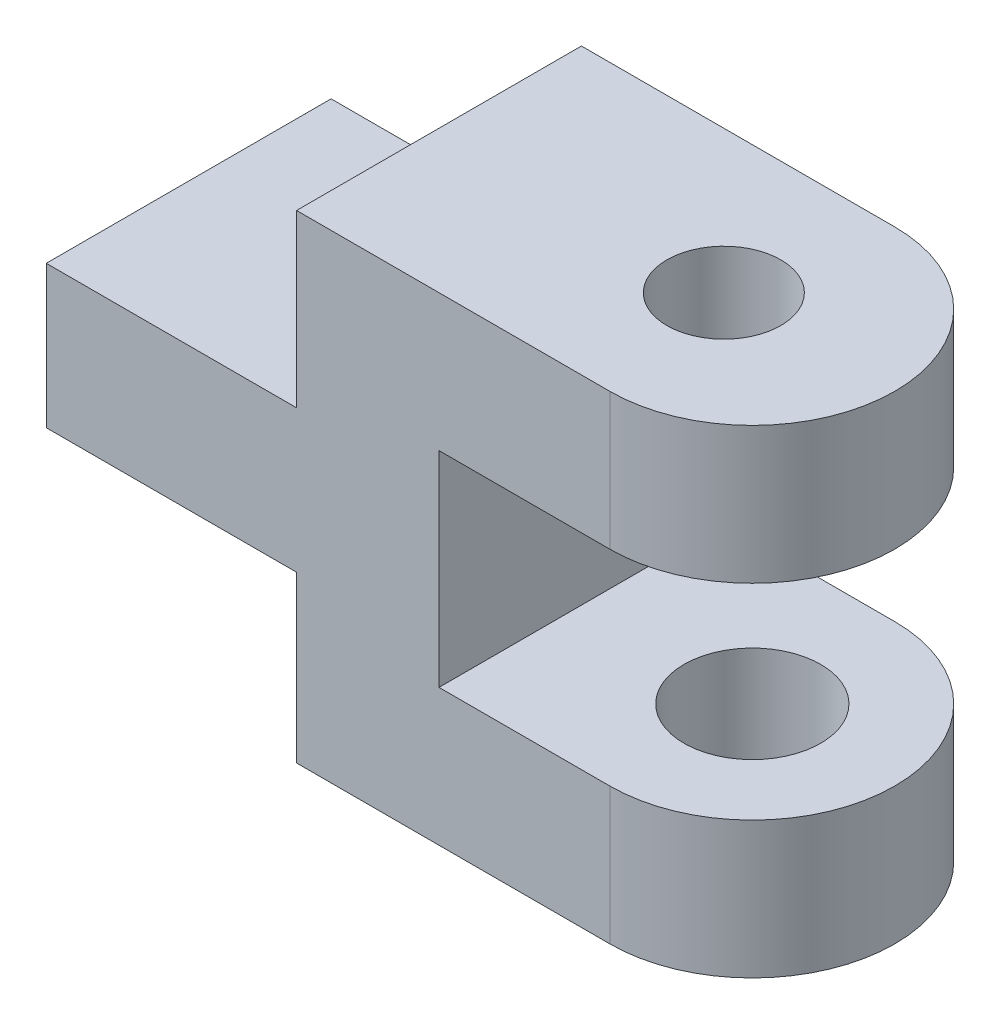
ISO-10303-21;
HEADER;
FILE_DESCRIPTION(('STEP AP214'),'2;1');
FILE_NAME('part.step','',(''),(''),'','','');
FILE_SCHEMA(('AUTOMOTIVE_DESIGN { 1 0 10303 214 1 1 1 1 }'));
ENDSEC;
DATA;
#1=APPLICATION_CONTEXT('core data for automotive mechanical design processes');
#2=APPLICATION_PROTOCOL_DEFINITION('international standard','automotive_design',2000,#1);
#3=PRODUCT_CONTEXT('',#1,'mechanical');
#4=PRODUCT('Part','Part','',(#3));
#5=PRODUCT_RELATED_PRODUCT_CATEGORY('part','',(#4));
#6=PRODUCT_DEFINITION_FORMATION('','',#4);
#7=PRODUCT_DEFINITION_CONTEXT('part definition',#1,'design');
#8=PRODUCT_DEFINITION('design','',#6,#7);
#9=PRODUCT_DEFINITION_SHAPE('','',#8);
#10=(LENGTH_UNIT() NAMED_UNIT(*) SI_UNIT(.MILLI.,.METRE.));
#11=(NAMED_UNIT(*) PLANE_ANGLE_UNIT() SI_UNIT($,.RADIAN.));
#12=(NAMED_UNIT(*) SI_UNIT($,.STERADIAN.) SOLID_ANGLE_UNIT());
#13=UNCERTAINTY_MEASURE_WITH_UNIT(LENGTH_MEASURE(1.E-05),#10,'distance_accuracy_value','');
#14=(GEOMETRIC_REPRESENTATION_CONTEXT(3) GLOBAL_UNCERTAINTY_ASSIGNED_CONTEXT((#13)) GLOBAL_UNIT_ASSIGNED_CONTEXT((#10,
#11,#12)) REPRESENTATION_CONTEXT('',''));
#15=CARTESIAN_POINT('',(0.,0.,0.));
#16=DIRECTION('',(0.,0.,1.));
#17=DIRECTION('',(1.,0.,0.));
#18=AXIS2_PLACEMENT_3D('',#15,#16,#17);
#19=CARTESIAN_POINT('',(0.,12.5,25.));
#20=DIRECTION('',(1.,0.,0.));
#21=DIRECTION('',(0.,0.,-1.));
#22=AXIS2_PLACEMENT_3D('',#19,#20,#21);
#23=PLANE('',#22);
#24=DIRECTION('',(0.,-1.,0.));
#25=VECTOR('',#24,1.);
#26=CARTESIAN_POINT('',(0.,12.5,0.));
#27=LINE('',#26,#25);
#28=CARTESIAN_POINT('',(0.,12.5,0.));
#29=VERTEX_POINT('',#28);
#30=CARTESIAN_POINT('',(0.,0.,0.));
#31=VERTEX_POINT('',#30);
#32=EDGE_CURVE('E161',#29,#31,#27,.T.);
#33=ORIENTED_EDGE('',*,*,#32,.T.);
#34=DIRECTION('',(0.,0.,-1.));
#35=VECTOR('',#34,1.);
#36=CARTESIAN_POINT('',(0.,0.,25.));
#37=LINE('',#36,#35);
#38=CARTESIAN_POINT('',(0.,0.,25.));
#39=VERTEX_POINT('',#38);
#40=EDGE_CURVE('E11',#39,#31,#37,.T.);
#41=ORIENTED_EDGE('',*,*,#40,.F.);
#42=DIRECTION('',(0.,-1.,0.));
#43=VECTOR('',#42,1.);
#44=CARTESIAN_POINT('',(0.,12.5,25.));
#45=LINE('',#44,#43);
#46=CARTESIAN_POINT('',(0.,12.5,25.));
#47=VERTEX_POINT('',#46);
#48=EDGE_CURVE('E198',#47,#39,#45,.T.);
#49=ORIENTED_EDGE('',*,*,#48,.F.);
#50=DIRECTION('',(0.,0.,-1.));
#51=VECTOR('',#50,1.);
#52=CARTESIAN_POINT('',(0.,12.5,25.));
#53=LINE('',#52,#51);
#54=EDGE_CURVE('E157',#47,#29,#53,.T.);
#55=ORIENTED_EDGE('',*,*,#54,.T.);
#56=EDGE_LOOP('',(#33,#41,#49,#55));
#57=FACE_BOUND('',#56,.T.);
#58=ADVANCED_FACE('F39',(#57),#23,.F.);
#59=CARTESIAN_POINT('',(0.,0.,25.));
#60=DIRECTION('',(0.,1.,0.));
#61=DIRECTION('',(0.,0.,1.));
#62=AXIS2_PLACEMENT_3D('',#59,#60,#61);
#63=PLANE('',#62);
#64=DIRECTION('',(1.,0.,0.));
#65=VECTOR('',#64,1.);
#66=CARTESIAN_POINT('',(0.,0.,0.));
#67=LINE('',#66,#65);
#68=CARTESIAN_POINT('',(21.969696969697,0.,0.));
#69=VERTEX_POINT('',#68);
#70=EDGE_CURVE('E165',#31,#69,#67,.T.);
#71=ORIENTED_EDGE('',*,*,#70,.T.);
#72=DIRECTION('',(0.,0.,-1.));
#73=VECTOR('',#72,1.);
#74=CARTESIAN_POINT('',(21.969696969697,0.,25.));
#75=LINE('',#74,#73);
#76=CARTESIAN_POINT('',(21.969696969697,0.,25.));
#77=VERTEX_POINT('',#76);
#78=EDGE_CURVE('E48',#77,#69,#75,.T.);
#79=ORIENTED_EDGE('',*,*,#78,.F.);
#80=DIRECTION('',(1.,0.,0.));
#81=VECTOR('',#80,1.);
#82=CARTESIAN_POINT('',(0.,0.,25.));
#83=LINE('',#82,#81);
#84=EDGE_CURVE('E106',#39,#77,#83,.T.);
#85=ORIENTED_EDGE('',*,*,#84,.F.);
#86=ORIENTED_EDGE('',*,*,#40,.T.);
#87=EDGE_LOOP('',(#71,#79,#85,#86));
#88=FACE_BOUND('',#87,.T.);
#89=ADVANCED_FACE('F278',(#88),#63,.F.);
#90=CARTESIAN_POINT('',(21.969696969697,0.,25.));
#91=DIRECTION('',(1.,0.,0.));
#92=DIRECTION('',(0.,1.,0.));
#93=AXIS2_PLACEMENT_3D('',#90,#91,#92);
#94=PLANE('',#93);
#95=DIRECTION('',(0.,-1.,0.));
#96=VECTOR('',#95,1.);
#97=CARTESIAN_POINT('',(21.969696969697,0.,0.));
#98=LINE('',#97,#96);
#99=CARTESIAN_POINT('',(21.969696969697,-14.5,0.));
#100=VERTEX_POINT('',#99);
#101=EDGE_CURVE('E169',#69,#100,#98,.T.);
#102=ORIENTED_EDGE('',*,*,#101,.T.);
#103=DIRECTION('',(0.,0.,-1.));
#104=VECTOR('',#103,1.);
#105=CARTESIAN_POINT('',(21.969696969697,-14.5,25.));
#106=LINE('',#105,#104);
#107=CARTESIAN_POINT('',(21.969696969697,-14.5,25.));
#108=VERTEX_POINT('',#107);
#109=EDGE_CURVE('E210',#108,#100,#106,.T.);
#110=ORIENTED_EDGE('',*,*,#109,.F.);
#111=DIRECTION('',(0.,-1.,0.));
#112=VECTOR('',#111,1.);
#113=CARTESIAN_POINT('',(21.969696969697,0.,25.));
#114=LINE('',#113,#112);
#115=EDGE_CURVE('E220',#77,#108,#114,.T.);
#116=ORIENTED_EDGE('',*,*,#115,.F.);
#117=ORIENTED_EDGE('',*,*,#78,.T.);
#118=EDGE_LOOP('',(#102,#110,#116,#117));
#119=FACE_BOUND('',#118,.T.);
#120=ADVANCED_FACE('F218',(#119),#94,.F.);
#121=CARTESIAN_POINT('',(21.969696969697,-14.5,25.));
#122=DIRECTION('',(0.,1.,0.));
#123=DIRECTION('',(-1.,0.,0.));
#124=AXIS2_PLACEMENT_3D('',#121,#122,#123);
#125=PLANE('',#124);
#126=CARTESIAN_POINT('',(49.469696969697,-14.5,12.5));
#127=DIRECTION('',(0.,1.,0.));
#128=DIRECTION('',(-1.,0.,0.));
#129=AXIS2_PLACEMENT_3D('',#126,#127,#128);
#130=CIRCLE('',#129,6.);
#131=CARTESIAN_POINT('',(43.469696969697,-14.5,12.5));
#132=VERTEX_POINT('',#131);
#133=EDGE_CURVE('E330',#132,#132,#130,.T.);
#134=ORIENTED_EDGE('',*,*,#133,.T.);
#135=EDGE_LOOP('',(#134));
#136=FACE_BOUND('',#135,.T.);
#137=DIRECTION('',(1.,0.,0.));
#138=VECTOR('',#137,1.);
#139=CARTESIAN_POINT('',(21.969696969697,-14.5,0.));
#140=LINE('',#139,#138);
#141=CARTESIAN_POINT('',(49.469696969697,-14.5,0.));
#142=VERTEX_POINT('',#141);
#143=EDGE_CURVE('E172',#100,#142,#140,.T.);
#144=ORIENTED_EDGE('',*,*,#143,.T.);
#145=CARTESIAN_POINT('',(49.469696969697,-14.5,12.5));
#146=DIRECTION('',(0.,1.,0.));
#147=DIRECTION('',(-1.,0.,0.));
#148=AXIS2_PLACEMENT_3D('',#145,#146,#147);
#149=CIRCLE('',#148,12.5);
#150=CARTESIAN_POINT('',(49.469696969697,-14.5,25.));
#151=VERTEX_POINT('',#150);
#152=EDGE_CURVE('E232',#151,#142,#149,.T.);
#153=ORIENTED_EDGE('',*,*,#152,.F.);
#154=DIRECTION('',(1.,0.,0.));
#155=VECTOR('',#154,1.);
#156=CARTESIAN_POINT('',(21.969696969697,-14.5,25.));
#157=LINE('',#156,#155);
#158=EDGE_CURVE('E233',#108,#151,#157,.T.);
#159=ORIENTED_EDGE('',*,*,#158,.F.);
#160=ORIENTED_EDGE('',*,*,#109,.T.);
#161=EDGE_LOOP('',(#144,#153,#159,#160));
#162=FACE_BOUND('',#161,.T.);
#163=ADVANCED_FACE('F230',(#136,#162),#125,.F.);
#164=CARTESIAN_POINT('',(49.469696969697,-2.49999999999999,25.));
#165=DIRECTION('',(0.,-1.,0.));
#166=DIRECTION('',(1.,0.,0.));
#167=AXIS2_PLACEMENT_3D('',#164,#165,#166);
#168=PLANE('',#167);
#169=CARTESIAN_POINT('',(49.469696969697,-2.49999999999999,12.5));
#170=DIRECTION('',(0.,1.,0.));
#171=DIRECTION('',(-1.,0.,0.));
#172=AXIS2_PLACEMENT_3D('',#169,#170,#171);
#173=CIRCLE('',#172,6.);
#174=CARTESIAN_POINT('',(43.4696969696969,-2.49999999999999,12.5));
#175=VERTEX_POINT('',#174);
#176=EDGE_CURVE('E333',#175,#175,#173,.T.);
#177=ORIENTED_EDGE('',*,*,#176,.F.);
#178=EDGE_LOOP('',(#177));
#179=FACE_BOUND('',#178,.T.);
#180=DIRECTION('',(-1.,0.,0.));
#181=VECTOR('',#180,1.);
#182=CARTESIAN_POINT('',(49.469696969697,-2.49999999999999,25.));
#183=LINE('',#182,#181);
#184=CARTESIAN_POINT('',(49.469696969697,-2.49999999999999,25.));
#185=VERTEX_POINT('',#184);
#186=CARTESIAN_POINT('',(34.469696969697,-2.49999999999999,25.));
#187=VERTEX_POINT('',#186);
#188=EDGE_CURVE('E240',#185,#187,#183,.T.);
#189=ORIENTED_EDGE('',*,*,#188,.F.);
#190=CARTESIAN_POINT('',(49.469696969697,-2.49999999999999,12.5));
#191=DIRECTION('',(0.,1.,0.));
#192=DIRECTION('',(-1.,0.,0.));
#193=AXIS2_PLACEMENT_3D('',#190,#191,#192);
#194=CIRCLE('',#193,12.5);
#195=CARTESIAN_POINT('',(49.469696969697,-2.49999999999999,0.));
#196=VERTEX_POINT('',#195);
#197=EDGE_CURVE('E270',#185,#196,#194,.T.);
#198=ORIENTED_EDGE('',*,*,#197,.T.);
#199=DIRECTION('',(-1.,0.,0.));
#200=VECTOR('',#199,1.);
#201=CARTESIAN_POINT('',(49.469696969697,-2.49999999999999,0.));
#202=LINE('',#201,#200);
#203=CARTESIAN_POINT('',(34.469696969697,-2.49999999999999,0.));
#204=VERTEX_POINT('',#203);
#205=EDGE_CURVE('E179',#196,#204,#202,.T.);
#206=ORIENTED_EDGE('',*,*,#205,.T.);
#207=DIRECTION('',(0.,0.,-1.));
#208=VECTOR('',#207,1.);
#209=CARTESIAN_POINT('',(34.469696969697,-2.49999999999999,25.));
#210=LINE('',#209,#208);
#211=EDGE_CURVE('E206',#187,#204,#210,.T.);
#212=ORIENTED_EDGE('',*,*,#211,.F.);
#213=EDGE_LOOP('',(#189,#198,#206,#212));
#214=FACE_BOUND('',#213,.T.);
#215=ADVANCED_FACE('F288',(#179,#214),#168,.F.);
#216=CARTESIAN_POINT('',(34.469696969697,-2.49999999999999,25.));
#217=DIRECTION('',(-1.,0.,0.));
#218=DIRECTION('',(0.,0.,1.));
#219=AXIS2_PLACEMENT_3D('',#216,#217,#218);
#220=PLANE('',#219);
#221=DIRECTION('',(0.,1.,0.));
#222=VECTOR('',#221,1.);
#223=CARTESIAN_POINT('',(34.469696969697,-2.49999999999999,0.));
#224=LINE('',#223,#222);
#225=CARTESIAN_POINT('',(34.469696969697,15.5,0.));
#226=VERTEX_POINT('',#225);
#227=EDGE_CURVE('E182',#204,#226,#224,.T.);
#228=ORIENTED_EDGE('',*,*,#227,.T.);
#229=DIRECTION('',(0.,0.,-1.));
#230=VECTOR('',#229,1.);
#231=CARTESIAN_POINT('',(34.469696969697,15.5,25.));
#232=LINE('',#231,#230);
#233=CARTESIAN_POINT('',(34.469696969697,15.5,25.));
#234=VERTEX_POINT('',#233);
#235=EDGE_CURVE('E150',#234,#226,#232,.T.);
#236=ORIENTED_EDGE('',*,*,#235,.F.);
#237=DIRECTION('',(0.,1.,0.));
#238=VECTOR('',#237,1.);
#239=CARTESIAN_POINT('',(34.469696969697,-2.49999999999999,25.));
#240=LINE('',#239,#238);
#241=EDGE_CURVE('E247',#187,#234,#240,.T.);
#242=ORIENTED_EDGE('',*,*,#241,.F.);
#243=ORIENTED_EDGE('',*,*,#211,.T.);
#244=EDGE_LOOP('',(#228,#236,#242,#243));
#245=FACE_BOUND('',#244,.T.);
#246=ADVANCED_FACE('F292',(#245),#220,.F.);
#247=CARTESIAN_POINT('',(34.469696969697,15.5,25.));
#248=DIRECTION('',(0.,1.,0.));
#249=DIRECTION('',(0.,0.,1.));
#250=AXIS2_PLACEMENT_3D('',#247,#248,#249);
#251=PLANE('',#250);
#252=CARTESIAN_POINT('',(46.969696969697,15.5,12.5));
#253=DIRECTION('',(0.,1.,0.));
#254=DIRECTION('',(-1.,0.,0.));
#255=AXIS2_PLACEMENT_3D('',#252,#253,#254);
#256=CIRCLE('',#255,5.);
#257=CARTESIAN_POINT('',(41.969696969697,15.5,12.5));
#258=VERTEX_POINT('',#257);
#259=EDGE_CURVE('E340',#258,#258,#256,.T.);
#260=ORIENTED_EDGE('',*,*,#259,.T.);
#261=EDGE_LOOP('',(#260));
#262=FACE_BOUND('',#261,.T.);
#263=DIRECTION('',(1.,0.,0.));
#264=VECTOR('',#263,1.);
#265=CARTESIAN_POINT('',(34.469696969697,15.5,0.));
#266=LINE('',#265,#264);
#267=CARTESIAN_POINT('',(49.469696969697,15.5,0.));
#268=VERTEX_POINT('',#267);
#269=EDGE_CURVE('E185',#226,#268,#266,.T.);
#270=ORIENTED_EDGE('',*,*,#269,.T.);
#271=CARTESIAN_POINT('',(49.469696969697,15.5,12.5));
#272=DIRECTION('',(0.,1.,0.));
#273=DIRECTION('',(-1.,0.,0.));
#274=AXIS2_PLACEMENT_3D('',#271,#272,#273);
#275=CIRCLE('',#274,12.5);
#276=CARTESIAN_POINT('',(49.469696969697,15.5,25.));
#277=VERTEX_POINT('',#276);
#278=EDGE_CURVE('E166',#277,#268,#275,.T.);
#279=ORIENTED_EDGE('',*,*,#278,.F.);
#280=DIRECTION('',(1.,0.,0.));
#281=VECTOR('',#280,1.);
#282=CARTESIAN_POINT('',(34.469696969697,15.5,25.));
#283=LINE('',#282,#281);
#284=EDGE_CURVE('E250',#234,#277,#283,.T.);
#285=ORIENTED_EDGE('',*,*,#284,.F.);
#286=ORIENTED_EDGE('',*,*,#235,.T.);
#287=EDGE_LOOP('',(#270,#279,#285,#286));
#288=FACE_BOUND('',#287,.T.);
#289=ADVANCED_FACE('F262',(#262,#288),#251,.F.);
#290=CARTESIAN_POINT('',(49.469696969697,27.5,25.));
#291=DIRECTION('',(0.,-1.,0.));
#292=DIRECTION('',(1.,0.,0.));
#293=AXIS2_PLACEMENT_3D('',#290,#291,#292);
#294=PLANE('',#293);
#295=CARTESIAN_POINT('',(46.969696969697,27.5,12.5));
#296=DIRECTION('',(0.,1.,0.));
#297=DIRECTION('',(-1.,0.,0.));
#298=AXIS2_PLACEMENT_3D('',#295,#296,#297);
#299=CIRCLE('',#298,5.);
#300=CARTESIAN_POINT('',(41.969696969697,27.5,12.5));
#301=VERTEX_POINT('',#300);
#302=EDGE_CURVE('E337',#301,#301,#299,.T.);
#303=ORIENTED_EDGE('',*,*,#302,.F.);
#304=EDGE_LOOP('',(#303));
#305=FACE_BOUND('',#304,.T.);
#306=DIRECTION('',(-1.,0.,0.));
#307=VECTOR('',#306,1.);
#308=CARTESIAN_POINT('',(49.469696969697,27.5,25.));
#309=LINE('',#308,#307);
#310=CARTESIAN_POINT('',(49.469696969697,27.5,25.));
#311=VERTEX_POINT('',#310);
#312=CARTESIAN_POINT('',(21.969696969697,27.5,25.));
#313=VERTEX_POINT('',#312);
#314=EDGE_CURVE('E133',#311,#313,#309,.T.);
#315=ORIENTED_EDGE('',*,*,#314,.F.);
#316=CARTESIAN_POINT('',(49.469696969697,27.5,12.5));
#317=DIRECTION('',(0.,1.,0.));
#318=DIRECTION('',(-1.,0.,0.));
#319=AXIS2_PLACEMENT_3D('',#316,#317,#318);
#320=CIRCLE('',#319,12.5);
#321=CARTESIAN_POINT('',(49.469696969697,27.5,0.));
#322=VERTEX_POINT('',#321);
#323=EDGE_CURVE('E261',#311,#322,#320,.T.);
#324=ORIENTED_EDGE('',*,*,#323,.T.);
#325=DIRECTION('',(-1.,0.,0.));
#326=VECTOR('',#325,1.);
#327=CARTESIAN_POINT('',(49.469696969697,27.5,0.));
#328=LINE('',#327,#326);
#329=CARTESIAN_POINT('',(21.969696969697,27.5,0.));
#330=VERTEX_POINT('',#329);
#331=EDGE_CURVE('E148',#322,#330,#328,.T.);
#332=ORIENTED_EDGE('',*,*,#331,.T.);
#333=DIRECTION('',(0.,0.,-1.));
#334=VECTOR('',#333,1.);
#335=CARTESIAN_POINT('',(21.969696969697,27.5,25.));
#336=LINE('',#335,#334);
#337=EDGE_CURVE('E145',#313,#330,#336,.T.);
#338=ORIENTED_EDGE('',*,*,#337,.F.);
#339=EDGE_LOOP('',(#315,#324,#332,#338));
#340=FACE_BOUND('',#339,.T.);
#341=ADVANCED_FACE('F146',(#305,#340),#294,.F.);
#342=CARTESIAN_POINT('',(21.969696969697,27.5,25.));
#343=DIRECTION('',(1.,0.,0.));
#344=DIRECTION('',(0.,1.,0.));
#345=AXIS2_PLACEMENT_3D('',#342,#343,#344);
#346=PLANE('',#345);
#347=DIRECTION('',(0.,-1.,0.));
#348=VECTOR('',#347,1.);
#349=CARTESIAN_POINT('',(21.969696969697,27.5,0.));
#350=LINE('',#349,#348);
#351=CARTESIAN_POINT('',(21.969696969697,12.5,0.));
#352=VERTEX_POINT('',#351);
#353=EDGE_CURVE('E92',#330,#352,#350,.T.);
#354=ORIENTED_EDGE('',*,*,#353,.T.);
#355=DIRECTION('',(0.,0.,-1.));
#356=VECTOR('',#355,1.);
#357=CARTESIAN_POINT('',(21.969696969697,12.5,25.));
#358=LINE('',#357,#356);
#359=CARTESIAN_POINT('',(21.969696969697,12.5,25.));
#360=VERTEX_POINT('',#359);
#361=EDGE_CURVE('E151',#360,#352,#358,.T.);
#362=ORIENTED_EDGE('',*,*,#361,.F.);
#363=DIRECTION('',(0.,-1.,0.));
#364=VECTOR('',#363,1.);
#365=CARTESIAN_POINT('',(21.969696969697,27.5,25.));
#366=LINE('',#365,#364);
#367=EDGE_CURVE('E137',#313,#360,#366,.T.);
#368=ORIENTED_EDGE('',*,*,#367,.F.);
#369=ORIENTED_EDGE('',*,*,#337,.T.);
#370=EDGE_LOOP('',(#354,#362,#368,#369));
#371=FACE_BOUND('',#370,.T.);
#372=ADVANCED_FACE('F153',(#371),#346,.F.);
#373=CARTESIAN_POINT('',(21.969696969697,12.5,25.));
#374=DIRECTION('',(0.,-1.,0.));
#375=DIRECTION('',(0.,0.,-1.));
#376=AXIS2_PLACEMENT_3D('',#373,#374,#375);
#377=PLANE('',#376);
#378=DIRECTION('',(-1.,0.,0.));
#379=VECTOR('',#378,1.);
#380=CARTESIAN_POINT('',(21.969696969697,12.5,0.));
#381=LINE('',#380,#379);
#382=EDGE_CURVE('E98',#352,#29,#381,.T.);
#383=ORIENTED_EDGE('',*,*,#382,.T.);
#384=ORIENTED_EDGE('',*,*,#54,.F.);
#385=DIRECTION('',(-1.,0.,0.));
#386=VECTOR('',#385,1.);
#387=CARTESIAN_POINT('',(21.969696969697,12.5,25.));
#388=LINE('',#387,#386);
#389=EDGE_CURVE('E56',#360,#47,#388,.T.);
#390=ORIENTED_EDGE('',*,*,#389,.F.);
#391=ORIENTED_EDGE('',*,*,#361,.T.);
#392=EDGE_LOOP('',(#383,#384,#390,#391));
#393=FACE_BOUND('',#392,.T.);
#394=ADVANCED_FACE('F305',(#393),#377,.F.);
#395=CARTESIAN_POINT('',(0.,0.,25.));
#396=DIRECTION('',(0.,0.,1.));
#397=DIRECTION('',(1.,0.,0.));
#398=AXIS2_PLACEMENT_3D('',#395,#396,#397);
#399=PLANE('',#398);
#400=ORIENTED_EDGE('',*,*,#48,.T.);
#401=ORIENTED_EDGE('',*,*,#84,.T.);
#402=ORIENTED_EDGE('',*,*,#115,.T.);
#403=ORIENTED_EDGE('',*,*,#158,.T.);
#404=DIRECTION('',(0.,1.,0.));
#405=VECTOR('',#404,1.);
#406=CARTESIAN_POINT('',(49.469696969697,-14.5,25.));
#407=LINE('',#406,#405);
#408=EDGE_CURVE('E236',#151,#185,#407,.T.);
#409=ORIENTED_EDGE('',*,*,#408,.T.);
#410=ORIENTED_EDGE('',*,*,#188,.T.);
#411=ORIENTED_EDGE('',*,*,#241,.T.);
#412=ORIENTED_EDGE('',*,*,#284,.T.);
#413=DIRECTION('',(0.,1.,0.));
#414=VECTOR('',#413,1.);
#415=CARTESIAN_POINT('',(49.469696969697,15.5,25.));
#416=LINE('',#415,#414);
#417=EDGE_CURVE('E139',#277,#311,#416,.T.);
#418=ORIENTED_EDGE('',*,*,#417,.T.);
#419=ORIENTED_EDGE('',*,*,#314,.T.);
#420=ORIENTED_EDGE('',*,*,#367,.T.);
#421=ORIENTED_EDGE('',*,*,#389,.T.);
#422=EDGE_LOOP('',(#400,#401,#402,#403,#409,#410,#411,#412,#418,#419,#420,#421));
#423=FACE_BOUND('',#422,.T.);
#424=ADVANCED_FACE('F135',(#423),#399,.T.);
#425=CARTESIAN_POINT('',(0.,0.,0.));
#426=DIRECTION('',(0.,0.,1.));
#427=DIRECTION('',(1.,0.,0.));
#428=AXIS2_PLACEMENT_3D('',#425,#426,#427);
#429=PLANE('',#428);
#430=ORIENTED_EDGE('',*,*,#32,.F.);
#431=ORIENTED_EDGE('',*,*,#382,.F.);
#432=ORIENTED_EDGE('',*,*,#353,.F.);
#433=ORIENTED_EDGE('',*,*,#331,.F.);
#434=DIRECTION('',(0.,1.,0.));
#435=VECTOR('',#434,1.);
#436=CARTESIAN_POINT('',(49.469696969697,15.5,0.));
#437=LINE('',#436,#435);
#438=EDGE_CURVE('E188',#268,#322,#437,.T.);
#439=ORIENTED_EDGE('',*,*,#438,.F.);
#440=ORIENTED_EDGE('',*,*,#269,.F.);
#441=ORIENTED_EDGE('',*,*,#227,.F.);
#442=ORIENTED_EDGE('',*,*,#205,.F.);
#443=DIRECTION('',(0.,1.,0.));
#444=VECTOR('',#443,1.);
#445=CARTESIAN_POINT('',(49.469696969697,-14.5,0.));
#446=LINE('',#445,#444);
#447=EDGE_CURVE('E175',#142,#196,#446,.T.);
#448=ORIENTED_EDGE('',*,*,#447,.F.);
#449=ORIENTED_EDGE('',*,*,#143,.F.);
#450=ORIENTED_EDGE('',*,*,#101,.F.);
#451=ORIENTED_EDGE('',*,*,#70,.F.);
#452=EDGE_LOOP('',(#430,#431,#432,#433,#439,#440,#441,#442,#448,#449,#450,#451));
#453=FACE_BOUND('',#452,.T.);
#454=ADVANCED_FACE('F224',(#453),#429,.F.);
#455=CARTESIAN_POINT('',(49.469696969697,15.5,12.5));
#456=DIRECTION('',(0.,1.,0.));
#457=DIRECTION('',(-1.,0.,0.));
#458=AXIS2_PLACEMENT_3D('',#455,#456,#457);
#459=CYLINDRICAL_SURFACE('',#458,12.5);
#460=ORIENTED_EDGE('',*,*,#417,.F.);
#461=ORIENTED_EDGE('',*,*,#278,.T.);
#462=ORIENTED_EDGE('',*,*,#438,.T.);
#463=ORIENTED_EDGE('',*,*,#323,.F.);
#464=EDGE_LOOP('',(#460,#461,#462,#463));
#465=FACE_BOUND('',#464,.T.);
#466=ADVANCED_FACE('F260',(#465),#459,.T.);
#467=CARTESIAN_POINT('',(49.469696969697,-14.5,12.5));
#468=DIRECTION('',(0.,1.,0.));
#469=DIRECTION('',(-1.,0.,0.));
#470=AXIS2_PLACEMENT_3D('',#467,#468,#469);
#471=CYLINDRICAL_SURFACE('',#470,12.5);
#472=ORIENTED_EDGE('',*,*,#408,.F.);
#473=ORIENTED_EDGE('',*,*,#152,.T.);
#474=ORIENTED_EDGE('',*,*,#447,.T.);
#475=ORIENTED_EDGE('',*,*,#197,.F.);
#476=EDGE_LOOP('',(#472,#473,#474,#475));
#477=FACE_BOUND('',#476,.T.);
#478=ADVANCED_FACE('F314',(#477),#471,.T.);
#479=CARTESIAN_POINT('',(46.969696969697,15.5,12.5));
#480=DIRECTION('',(0.,1.,0.));
#481=DIRECTION('',(-1.,0.,0.));
#482=AXIS2_PLACEMENT_3D('',#479,#480,#481);
#483=CYLINDRICAL_SURFACE('',#482,5.);
#484=ORIENTED_EDGE('',*,*,#259,.F.);
#485=EDGE_LOOP('',(#484));
#486=FACE_BOUND('',#485,.T.);
#487=ORIENTED_EDGE('',*,*,#302,.T.);
#488=EDGE_LOOP('',(#487));
#489=FACE_BOUND('',#488,.T.);
#490=ADVANCED_FACE('F317',(#486,#489),#483,.F.);
#491=CARTESIAN_POINT('',(49.469696969697,-14.5,12.5));
#492=DIRECTION('',(0.,1.,0.));
#493=DIRECTION('',(-1.,0.,0.));
#494=AXIS2_PLACEMENT_3D('',#491,#492,#493);
#495=CYLINDRICAL_SURFACE('',#494,6.);
#496=ORIENTED_EDGE('',*,*,#133,.F.);
#497=EDGE_LOOP('',(#496));
#498=FACE_BOUND('',#497,.T.);
#499=ORIENTED_EDGE('',*,*,#176,.T.);
#500=EDGE_LOOP('',(#499));
#501=FACE_BOUND('',#500,.T.);
#502=ADVANCED_FACE('F321',(#498,#501),#495,.F.);
#503=CLOSED_SHELL('',(#58,#89,#120,#163,#215,#246,#289,#341,#372,#394,#424,#454,#466,#478,#490,#502));
#504=MANIFOLD_SOLID_BREP('B2',#503);
#505=ADVANCED_BREP_SHAPE_REPRESENTATION('',(#18,#504),#14);
#506=SHAPE_DEFINITION_REPRESENTATION(#9,#505);
ENDSEC;
END-ISO-10303-21;
